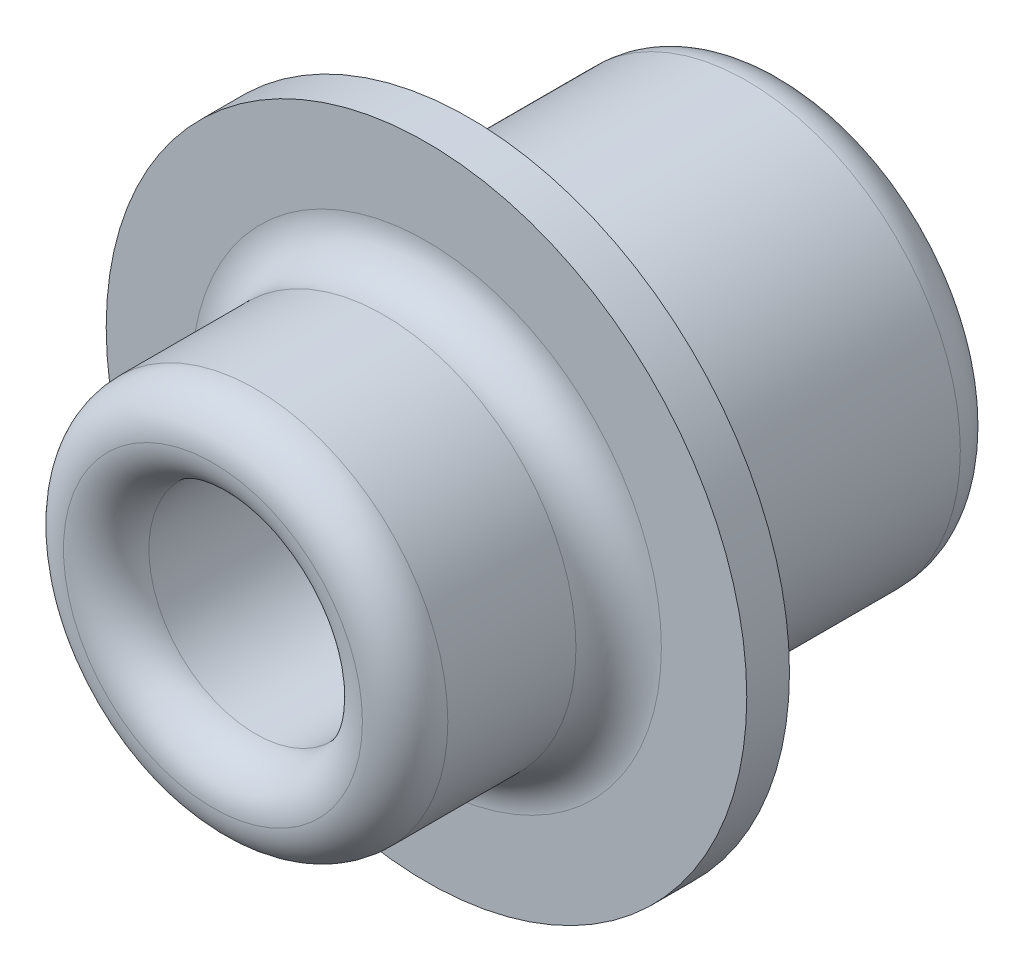
ISO-10303-21;
HEADER;
FILE_DESCRIPTION(('STEP AP214'),'2;1');
FILE_NAME('part.step','',(''),(''),'','','');
FILE_SCHEMA(('AUTOMOTIVE_DESIGN { 1 0 10303 214 1 1 1 1 }'));
ENDSEC;
DATA;
#1=APPLICATION_CONTEXT('core data for automotive mechanical design processes');
#2=APPLICATION_PROTOCOL_DEFINITION('international standard','automotive_design',2000,#1);
#3=PRODUCT_CONTEXT('',#1,'mechanical');
#4=PRODUCT('Part','Part','',(#3));
#5=PRODUCT_RELATED_PRODUCT_CATEGORY('part','',(#4));
#6=PRODUCT_DEFINITION_FORMATION('','',#4);
#7=PRODUCT_DEFINITION_CONTEXT('part definition',#1,'design');
#8=PRODUCT_DEFINITION('design','',#6,#7);
#9=PRODUCT_DEFINITION_SHAPE('','',#8);
#10=(LENGTH_UNIT() NAMED_UNIT(*) SI_UNIT(.MILLI.,.METRE.));
#11=(NAMED_UNIT(*) PLANE_ANGLE_UNIT() SI_UNIT($,.RADIAN.));
#12=(NAMED_UNIT(*) SI_UNIT($,.STERADIAN.) SOLID_ANGLE_UNIT());
#13=UNCERTAINTY_MEASURE_WITH_UNIT(LENGTH_MEASURE(1.E-05),#10,'distance_accuracy_value','');
#14=(GEOMETRIC_REPRESENTATION_CONTEXT(3) GLOBAL_UNCERTAINTY_ASSIGNED_CONTEXT((#13)) GLOBAL_UNIT_ASSIGNED_CONTEXT((#10,
#11,#12)) REPRESENTATION_CONTEXT('',''));
#15=CARTESIAN_POINT('',(0.,0.,0.));
#16=DIRECTION('',(0.,0.,1.));
#17=DIRECTION('',(1.,0.,0.));
#18=AXIS2_PLACEMENT_3D('',#15,#16,#17);
#19=CARTESIAN_POINT('',(0.,0.,0.));
#20=DIRECTION('',(0.,0.,1.));
#21=DIRECTION('',(1.,0.,0.));
#22=AXIS2_PLACEMENT_3D('',#19,#20,#21);
#23=PLANE('',#22);
#24=CARTESIAN_POINT('',(0.,0.,0.));
#25=DIRECTION('',(0.,0.,1.));
#26=DIRECTION('',(1.,0.,0.));
#27=AXIS2_PLACEMENT_3D('',#24,#25,#26);
#28=CIRCLE('',#27,8.);
#29=CARTESIAN_POINT('',(8.,0.,0.));
#30=VERTEX_POINT('',#29);
#31=EDGE_CURVE('E50',#30,#30,#28,.F.);
#32=ORIENTED_EDGE('',*,*,#31,.T.);
#33=EDGE_LOOP('',(#32));
#34=FACE_BOUND('',#33,.T.);
#35=CARTESIAN_POINT('',(0.,0.,0.));
#36=DIRECTION('',(0.,0.,1.));
#37=DIRECTION('',(1.,0.,0.));
#38=AXIS2_PLACEMENT_3D('',#35,#36,#37);
#39=CIRCLE('',#38,5.1);
#40=CARTESIAN_POINT('',(5.1,0.,0.));
#41=VERTEX_POINT('',#40);
#42=EDGE_CURVE('E69',#41,#41,#39,.T.);
#43=ORIENTED_EDGE('',*,*,#42,.T.);
#44=EDGE_LOOP('',(#43));
#45=FACE_BOUND('',#44,.T.);
#46=ADVANCED_FACE('F39',(#34,#45),#23,.F.);
#47=CARTESIAN_POINT('',(0.,0.,15.));
#48=DIRECTION('',(0.,0.,-1.));
#49=DIRECTION('',(-1.,0.,0.));
#50=AXIS2_PLACEMENT_3D('',#47,#48,#49);
#51=CYLINDRICAL_SURFACE('',#50,10.);
#52=CARTESIAN_POINT('',(0.,0.,2.));
#53=DIRECTION('',(0.,0.,1.));
#54=DIRECTION('',(1.,0.,0.));
#55=AXIS2_PLACEMENT_3D('',#52,#53,#54);
#56=CIRCLE('',#55,10.);
#57=CARTESIAN_POINT('',(10.,0.,2.));
#58=VERTEX_POINT('',#57);
#59=EDGE_CURVE('E51',#58,#58,#56,.T.);
#60=ORIENTED_EDGE('',*,*,#59,.T.);
#61=EDGE_LOOP('',(#60));
#62=FACE_BOUND('',#61,.T.);
#63=CARTESIAN_POINT('',(0.,0.,15.));
#64=DIRECTION('',(0.,0.,1.));
#65=DIRECTION('',(1.,0.,0.));
#66=AXIS2_PLACEMENT_3D('',#63,#64,#65);
#67=CIRCLE('',#66,10.);
#68=CARTESIAN_POINT('',(10.,0.,15.));
#69=VERTEX_POINT('',#68);
#70=EDGE_CURVE('E63',#69,#69,#67,.T.);
#71=ORIENTED_EDGE('',*,*,#70,.F.);
#72=EDGE_LOOP('',(#71));
#73=FACE_BOUND('',#72,.T.);
#74=ADVANCED_FACE('F106',(#62,#73),#51,.T.);
#75=CARTESIAN_POINT('',(0.,0.,15.));
#76=DIRECTION('',(0.,0.,-1.));
#77=DIRECTION('',(-1.,0.,0.));
#78=AXIS2_PLACEMENT_3D('',#75,#76,#77);
#79=CYLINDRICAL_SURFACE('',#78,5.1);
#80=CARTESIAN_POINT('',(0.,0.,15.));
#81=DIRECTION('',(0.,0.,1.));
#82=DIRECTION('',(1.,0.,0.));
#83=AXIS2_PLACEMENT_3D('',#80,#81,#82);
#84=CIRCLE('',#83,5.1);
#85=CARTESIAN_POINT('',(5.1,0.,15.));
#86=VERTEX_POINT('',#85);
#87=EDGE_CURVE('E72',#86,#86,#84,.T.);
#88=ORIENTED_EDGE('',*,*,#87,.T.);
#89=EDGE_LOOP('',(#88));
#90=FACE_BOUND('',#89,.T.);
#91=ORIENTED_EDGE('',*,*,#42,.F.);
#92=EDGE_LOOP('',(#91));
#93=FACE_BOUND('',#92,.T.);
#94=ADVANCED_FACE('F114',(#90,#93),#79,.F.);
#95=CARTESIAN_POINT('',(0.,0.,15.));
#96=DIRECTION('',(0.,0.,1.));
#97=DIRECTION('',(1.,0.,0.));
#98=AXIS2_PLACEMENT_3D('',#95,#96,#97);
#99=PLANE('',#98);
#100=CARTESIAN_POINT('',(0.,0.,15.));
#101=DIRECTION('',(0.,0.,1.));
#102=DIRECTION('',(1.,0.,0.));
#103=AXIS2_PLACEMENT_3D('',#100,#101,#102);
#104=CIRCLE('',#103,5.);
#105=CARTESIAN_POINT('',(5.,0.,15.));
#106=VERTEX_POINT('',#105);
#107=EDGE_CURVE('E80',#106,#106,#104,.T.);
#108=ORIENTED_EDGE('',*,*,#107,.T.);
#109=EDGE_LOOP('',(#108));
#110=FACE_BOUND('',#109,.T.);
#111=ORIENTED_EDGE('',*,*,#87,.F.);
#112=EDGE_LOOP('',(#111));
#113=FACE_BOUND('',#112,.T.);
#114=ADVANCED_FACE('F118',(#110,#113),#99,.F.);
#115=CARTESIAN_POINT('',(0.,0.,17.));
#116=DIRECTION('',(0.,0.,1.));
#117=DIRECTION('',(1.,0.,0.));
#118=AXIS2_PLACEMENT_3D('',#115,#116,#117);
#119=PLANE('',#118);
#120=CARTESIAN_POINT('',(0.,0.,17.));
#121=DIRECTION('',(0.,0.,1.));
#122=DIRECTION('',(1.,0.,0.));
#123=AXIS2_PLACEMENT_3D('',#120,#121,#122);
#124=CIRCLE('',#123,11.);
#125=CARTESIAN_POINT('',(11.,0.,17.));
#126=VERTEX_POINT('',#125);
#127=EDGE_CURVE('E10',#126,#126,#124,.F.);
#128=ORIENTED_EDGE('',*,*,#127,.T.);
#129=EDGE_LOOP('',(#128));
#130=FACE_BOUND('',#129,.T.);
#131=CARTESIAN_POINT('',(0.,0.,17.));
#132=DIRECTION('',(0.,0.,1.));
#133=DIRECTION('',(1.,0.,0.));
#134=AXIS2_PLACEMENT_3D('',#131,#132,#133);
#135=CIRCLE('',#134,15.);
#136=CARTESIAN_POINT('',(15.,0.,17.));
#137=VERTEX_POINT('',#136);
#138=EDGE_CURVE('E74',#137,#137,#135,.T.);
#139=ORIENTED_EDGE('',*,*,#138,.T.);
#140=EDGE_LOOP('',(#139));
#141=FACE_BOUND('',#140,.T.);
#142=ADVANCED_FACE('F126',(#130,#141),#119,.T.);
#143=ORIENTED_EDGE('',*,*,#70,.T.);
#144=EDGE_LOOP('',(#143));
#145=FACE_BOUND('',#144,.T.);
#146=CARTESIAN_POINT('',(0.,0.,15.));
#147=DIRECTION('',(0.,0.,1.));
#148=DIRECTION('',(1.,0.,0.));
#149=AXIS2_PLACEMENT_3D('',#146,#147,#148);
#150=CIRCLE('',#149,15.);
#151=CARTESIAN_POINT('',(15.,0.,15.));
#152=VERTEX_POINT('',#151);
#153=EDGE_CURVE('E73',#152,#152,#150,.T.);
#154=ORIENTED_EDGE('',*,*,#153,.F.);
#155=EDGE_LOOP('',(#154));
#156=FACE_BOUND('',#155,.T.);
#157=ADVANCED_FACE('F123',(#145,#156),#99,.F.);
#158=CARTESIAN_POINT('',(0.,0.,17.));
#159=DIRECTION('',(0.,0.,-1.));
#160=DIRECTION('',(-1.,0.,0.));
#161=AXIS2_PLACEMENT_3D('',#158,#159,#160);
#162=CYLINDRICAL_SURFACE('',#161,15.);
#163=ORIENTED_EDGE('',*,*,#138,.F.);
#164=EDGE_LOOP('',(#163));
#165=FACE_BOUND('',#164,.T.);
#166=ORIENTED_EDGE('',*,*,#153,.T.);
#167=EDGE_LOOP('',(#166));
#168=FACE_BOUND('',#167,.T.);
#169=ADVANCED_FACE('F122',(#165,#168),#162,.T.);
#170=CARTESIAN_POINT('',(0.,0.,17.));
#171=DIRECTION('',(0.,0.,-1.));
#172=DIRECTION('',(-1.,0.,0.));
#173=AXIS2_PLACEMENT_3D('',#170,#171,#172);
#174=CYLINDRICAL_SURFACE('',#173,5.);
#175=CARTESIAN_POINT('',(0.,0.,25.));
#176=DIRECTION('',(0.,0.,1.));
#177=DIRECTION('',(1.,0.,0.));
#178=AXIS2_PLACEMENT_3D('',#175,#176,#177);
#179=CIRCLE('',#178,5.);
#180=CARTESIAN_POINT('',(5.,0.,25.));
#181=VERTEX_POINT('',#180);
#182=EDGE_CURVE('E64',#181,#181,#179,.T.);
#183=ORIENTED_EDGE('',*,*,#182,.T.);
#184=EDGE_LOOP('',(#183));
#185=FACE_BOUND('',#184,.T.);
#186=ORIENTED_EDGE('',*,*,#107,.F.);
#187=EDGE_LOOP('',(#186));
#188=FACE_BOUND('',#187,.T.);
#189=ADVANCED_FACE('F101',(#185,#188),#174,.F.);
#190=CARTESIAN_POINT('',(0.,0.,27.));
#191=DIRECTION('',(0.,0.,-1.));
#192=DIRECTION('',(-1.,0.,0.));
#193=AXIS2_PLACEMENT_3D('',#190,#191,#192);
#194=CYLINDRICAL_SURFACE('',#193,9.);
#195=CARTESIAN_POINT('',(0.,0.,25.));
#196=DIRECTION('',(0.,0.,1.));
#197=DIRECTION('',(1.,0.,0.));
#198=AXIS2_PLACEMENT_3D('',#195,#196,#197);
#199=CIRCLE('',#198,9.);
#200=CARTESIAN_POINT('',(9.,0.,25.));
#201=VERTEX_POINT('',#200);
#202=EDGE_CURVE('E57',#201,#201,#199,.F.);
#203=ORIENTED_EDGE('',*,*,#202,.T.);
#204=EDGE_LOOP('',(#203));
#205=FACE_BOUND('',#204,.T.);
#206=CARTESIAN_POINT('',(0.,0.,19.));
#207=DIRECTION('',(0.,0.,1.));
#208=DIRECTION('',(1.,0.,0.));
#209=AXIS2_PLACEMENT_3D('',#206,#207,#208);
#210=CIRCLE('',#209,9.);
#211=CARTESIAN_POINT('',(9.,0.,19.));
#212=VERTEX_POINT('',#211);
#213=EDGE_CURVE('E56',#212,#212,#210,.T.);
#214=ORIENTED_EDGE('',*,*,#213,.T.);
#215=EDGE_LOOP('',(#214));
#216=FACE_BOUND('',#215,.T.);
#217=ADVANCED_FACE('F95',(#205,#216),#194,.T.);
#218=CARTESIAN_POINT('',(0.,0.,25.));
#219=DIRECTION('',(0.,0.,1.));
#220=DIRECTION('',(1.,0.,0.));
#221=AXIS2_PLACEMENT_3D('',#218,#219,#220);
#222=TOROIDAL_SURFACE('',#221,7.,2.);
#223=ORIENTED_EDGE('',*,*,#202,.F.);
#224=EDGE_LOOP('',(#223));
#225=FACE_BOUND('',#224,.T.);
#226=CARTESIAN_POINT('',(0.,0.,27.));
#227=DIRECTION('',(0.,0.,1.));
#228=DIRECTION('',(1.,0.,0.));
#229=AXIS2_PLACEMENT_3D('',#226,#227,#228);
#230=CIRCLE('',#229,7.);
#231=CARTESIAN_POINT('',(7.,0.,27.));
#232=VERTEX_POINT('',#231);
#233=EDGE_CURVE('E43',#232,#232,#230,.T.);
#234=ORIENTED_EDGE('',*,*,#233,.F.);
#235=EDGE_LOOP('',(#234));
#236=FACE_BOUND('',#235,.T.);
#237=ADVANCED_FACE('F89',(#225,#236),#222,.T.);
#238=CARTESIAN_POINT('',(0.,0.,25.));
#239=DIRECTION('',(0.,0.,1.));
#240=DIRECTION('',(1.,0.,0.));
#241=AXIS2_PLACEMENT_3D('',#238,#239,#240);
#242=TOROIDAL_SURFACE('',#241,7.,2.);
#243=ORIENTED_EDGE('',*,*,#233,.T.);
#244=EDGE_LOOP('',(#243));
#245=FACE_BOUND('',#244,.T.);
#246=ORIENTED_EDGE('',*,*,#182,.F.);
#247=EDGE_LOOP('',(#246));
#248=FACE_BOUND('',#247,.T.);
#249=ADVANCED_FACE('F87',(#245,#248),#242,.T.);
#250=CARTESIAN_POINT('',(0.,0.,2.));
#251=DIRECTION('',(0.,0.,1.));
#252=DIRECTION('',(1.,0.,0.));
#253=AXIS2_PLACEMENT_3D('',#250,#251,#252);
#254=TOROIDAL_SURFACE('',#253,8.,2.);
#255=ORIENTED_EDGE('',*,*,#31,.F.);
#256=EDGE_LOOP('',(#255));
#257=FACE_BOUND('',#256,.T.);
#258=ORIENTED_EDGE('',*,*,#59,.F.);
#259=EDGE_LOOP('',(#258));
#260=FACE_BOUND('',#259,.T.);
#261=ADVANCED_FACE('F97',(#257,#260),#254,.T.);
#262=CARTESIAN_POINT('',(0.,0.,19.));
#263=DIRECTION('',(0.,0.,1.));
#264=DIRECTION('',(1.,0.,0.));
#265=AXIS2_PLACEMENT_3D('',#262,#263,#264);
#266=TOROIDAL_SURFACE('',#265,11.,2.);
#267=ORIENTED_EDGE('',*,*,#127,.F.);
#268=EDGE_LOOP('',(#267));
#269=FACE_BOUND('',#268,.T.);
#270=ORIENTED_EDGE('',*,*,#213,.F.);
#271=EDGE_LOOP('',(#270));
#272=FACE_BOUND('',#271,.T.);
#273=ADVANCED_FACE('F41',(#269,#272),#266,.F.);
#274=CLOSED_SHELL('',(#46,#74,#94,#114,#142,#157,#169,#189,#217,#237,#249,#261,#273));
#275=MANIFOLD_SOLID_BREP('B2',#274);
#276=ADVANCED_BREP_SHAPE_REPRESENTATION('',(#18,#275),#14);
#277=SHAPE_DEFINITION_REPRESENTATION(#9,#276);
ENDSEC;
END-ISO-10303-21;
